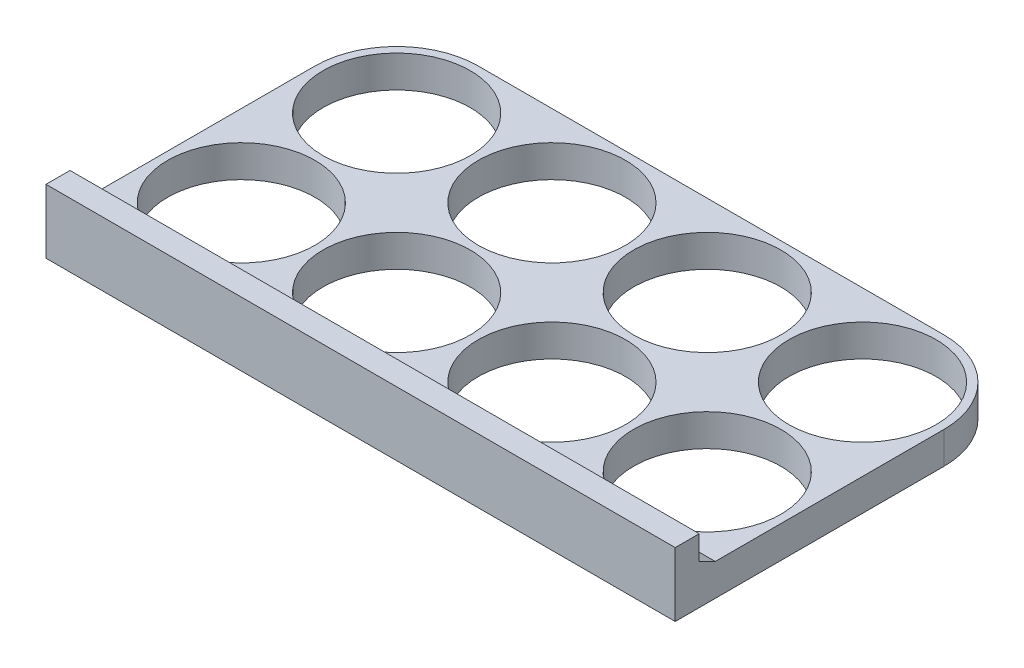
ISO-10303-21;
HEADER;
FILE_DESCRIPTION(('STEP AP214'),'2;1');
FILE_NAME('part.step','',(''),(''),'','','');
FILE_SCHEMA(('AUTOMOTIVE_DESIGN { 1 0 10303 214 1 1 1 1 }'));
ENDSEC;
DATA;
#1=APPLICATION_CONTEXT('core data for automotive mechanical design processes');
#2=APPLICATION_PROTOCOL_DEFINITION('international standard','automotive_design',2000,#1);
#3=PRODUCT_CONTEXT('',#1,'mechanical');
#4=PRODUCT('Part','Part','',(#3));
#5=PRODUCT_RELATED_PRODUCT_CATEGORY('part','',(#4));
#6=PRODUCT_DEFINITION_FORMATION('','',#4);
#7=PRODUCT_DEFINITION_CONTEXT('part definition',#1,'design');
#8=PRODUCT_DEFINITION('design','',#6,#7);
#9=PRODUCT_DEFINITION_SHAPE('','',#8);
#10=(LENGTH_UNIT() NAMED_UNIT(*) SI_UNIT(.MILLI.,.METRE.));
#11=(NAMED_UNIT(*) PLANE_ANGLE_UNIT() SI_UNIT($,.RADIAN.));
#12=(NAMED_UNIT(*) SI_UNIT($,.STERADIAN.) SOLID_ANGLE_UNIT());
#13=UNCERTAINTY_MEASURE_WITH_UNIT(LENGTH_MEASURE(1.E-05),#10,'distance_accuracy_value','');
#14=(GEOMETRIC_REPRESENTATION_CONTEXT(3) GLOBAL_UNCERTAINTY_ASSIGNED_CONTEXT((#13)) GLOBAL_UNIT_ASSIGNED_CONTEXT((#10,
#11,#12)) REPRESENTATION_CONTEXT('',''));
#15=CARTESIAN_POINT('',(0.,0.,0.));
#16=DIRECTION('',(0.,0.,1.));
#17=DIRECTION('',(1.,0.,0.));
#18=AXIS2_PLACEMENT_3D('',#15,#16,#17);
#19=CARTESIAN_POINT('',(58.2,4.,-19.4));
#20=DIRECTION('',(0.,-1.,0.));
#21=DIRECTION('',(0.,0.,-1.));
#22=AXIS2_PLACEMENT_3D('',#19,#20,#21);
#23=PLANE('',#22);
#24=CARTESIAN_POINT('',(19.3999999999999,4.,-19.4));
#25=DIRECTION('',(0.,1.,0.));
#26=DIRECTION('',(0.,0.,1.));
#27=AXIS2_PLACEMENT_3D('',#24,#25,#26);
#28=CIRCLE('',#27,9.2);
#29=CARTESIAN_POINT('',(19.3999999999999,4.,-10.2));
#30=VERTEX_POINT('',#29);
#31=EDGE_CURVE('E258',#30,#30,#28,.T.);
#32=ORIENTED_EDGE('',*,*,#31,.F.);
#33=EDGE_LOOP('',(#32));
#34=FACE_BOUND('',#33,.T.);
#35=CARTESIAN_POINT('',(38.7999999999999,4.,-19.4));
#36=DIRECTION('',(0.,1.,0.));
#37=DIRECTION('',(0.,0.,1.));
#38=AXIS2_PLACEMENT_3D('',#35,#36,#37);
#39=CIRCLE('',#38,9.2);
#40=CARTESIAN_POINT('',(38.7999999999999,4.,-10.2));
#41=VERTEX_POINT('',#40);
#42=EDGE_CURVE('E265',#41,#41,#39,.T.);
#43=ORIENTED_EDGE('',*,*,#42,.F.);
#44=EDGE_LOOP('',(#43));
#45=FACE_BOUND('',#44,.T.);
#46=CARTESIAN_POINT('',(58.1999999999999,4.,-19.4));
#47=DIRECTION('',(0.,1.,0.));
#48=DIRECTION('',(0.,0.,1.));
#49=AXIS2_PLACEMENT_3D('',#46,#47,#48);
#50=CIRCLE('',#49,9.2);
#51=CARTESIAN_POINT('',(58.1999999999999,4.,-10.2));
#52=VERTEX_POINT('',#51);
#53=EDGE_CURVE('E273',#52,#52,#50,.T.);
#54=ORIENTED_EDGE('',*,*,#53,.F.);
#55=EDGE_LOOP('',(#54));
#56=FACE_BOUND('',#55,.T.);
#57=CARTESIAN_POINT('',(0.,4.,-19.4));
#58=DIRECTION('',(0.,1.,0.));
#59=DIRECTION('',(0.,0.,1.));
#60=AXIS2_PLACEMENT_3D('',#57,#58,#59);
#61=CIRCLE('',#60,9.2);
#62=CARTESIAN_POINT('',(0.,4.,-10.2));
#63=VERTEX_POINT('',#62);
#64=EDGE_CURVE('E281',#63,#63,#61,.T.);
#65=ORIENTED_EDGE('',*,*,#64,.F.);
#66=EDGE_LOOP('',(#65));
#67=FACE_BOUND('',#66,.T.);
#68=DIRECTION('',(-1.,0.,0.));
#69=VECTOR('',#68,1.);
#70=CARTESIAN_POINT('',(68.4,4.,9.2));
#71=LINE('',#70,#69);
#72=CARTESIAN_POINT('',(68.4,4.,9.2));
#73=VERTEX_POINT('',#72);
#74=CARTESIAN_POINT('',(58.2,4.,9.2));
#75=VERTEX_POINT('',#74);
#76=EDGE_CURVE('E140',#73,#75,#71,.T.);
#77=ORIENTED_EDGE('',*,*,#76,.F.);
#78=DIRECTION('',(0.,0.,-1.));
#79=VECTOR('',#78,1.);
#80=CARTESIAN_POINT('',(68.4,4.,14.2));
#81=LINE('',#80,#79);
#82=CARTESIAN_POINT('',(68.4,4.,-19.4));
#83=VERTEX_POINT('',#82);
#84=EDGE_CURVE('E100',#73,#83,#81,.T.);
#85=ORIENTED_EDGE('',*,*,#84,.T.);
#86=CARTESIAN_POINT('',(58.2,4.,-19.4));
#87=DIRECTION('',(0.,1.,0.));
#88=DIRECTION('',(0.,0.,-1.));
#89=AXIS2_PLACEMENT_3D('',#86,#87,#88);
#90=CIRCLE('',#89,10.2);
#91=CARTESIAN_POINT('',(58.2,4.,-29.6));
#92=VERTEX_POINT('',#91);
#93=EDGE_CURVE('E160',#83,#92,#90,.T.);
#94=ORIENTED_EDGE('',*,*,#93,.T.);
#95=DIRECTION('',(-1.,0.,0.));
#96=VECTOR('',#95,1.);
#97=CARTESIAN_POINT('',(0.,4.,-29.6));
#98=LINE('',#97,#96);
#99=CARTESIAN_POINT('',(0.,4.,-29.6));
#100=VERTEX_POINT('',#99);
#101=EDGE_CURVE('E165',#92,#100,#98,.T.);
#102=ORIENTED_EDGE('',*,*,#101,.T.);
#103=CARTESIAN_POINT('',(0.,4.,-19.4));
#104=DIRECTION('',(0.,1.,0.));
#105=DIRECTION('',(0.,0.,-1.));
#106=AXIS2_PLACEMENT_3D('',#103,#104,#105);
#107=CIRCLE('',#106,10.2);
#108=CARTESIAN_POINT('',(-10.2,4.,-19.4));
#109=VERTEX_POINT('',#108);
#110=EDGE_CURVE('E63',#100,#109,#107,.T.);
#111=ORIENTED_EDGE('',*,*,#110,.T.);
#112=DIRECTION('',(0.,0.,1.));
#113=VECTOR('',#112,1.);
#114=CARTESIAN_POINT('',(-10.2,4.,0.));
#115=LINE('',#114,#113);
#116=CARTESIAN_POINT('',(-10.2,4.,9.2));
#117=VERTEX_POINT('',#116);
#118=EDGE_CURVE('E176',#109,#117,#115,.T.);
#119=ORIENTED_EDGE('',*,*,#118,.T.);
#120=CARTESIAN_POINT('',(0.,4.,9.2));
#121=VERTEX_POINT('',#120);
#122=EDGE_CURVE('E157',#121,#117,#71,.T.);
#123=ORIENTED_EDGE('',*,*,#122,.F.);
#124=CARTESIAN_POINT('',(0.,4.,0.));
#125=DIRECTION('',(0.,1.,0.));
#126=DIRECTION('',(0.,0.,1.));
#127=AXIS2_PLACEMENT_3D('',#124,#125,#126);
#128=CIRCLE('',#127,9.2);
#129=EDGE_CURVE('E183',#121,#121,#128,.T.);
#130=ORIENTED_EDGE('',*,*,#129,.F.);
#131=CARTESIAN_POINT('',(19.4,4.,9.2));
#132=VERTEX_POINT('',#131);
#133=EDGE_CURVE('E230',#132,#121,#71,.T.);
#134=ORIENTED_EDGE('',*,*,#133,.F.);
#135=CARTESIAN_POINT('',(19.4,4.,0.));
#136=DIRECTION('',(0.,1.,0.));
#137=DIRECTION('',(0.,0.,1.));
#138=AXIS2_PLACEMENT_3D('',#135,#136,#137);
#139=CIRCLE('',#138,9.2);
#140=EDGE_CURVE('E237',#132,#132,#139,.T.);
#141=ORIENTED_EDGE('',*,*,#140,.F.);
#142=CARTESIAN_POINT('',(38.8,4.,9.2));
#143=VERTEX_POINT('',#142);
#144=EDGE_CURVE('E615',#143,#132,#71,.T.);
#145=ORIENTED_EDGE('',*,*,#144,.F.);
#146=CARTESIAN_POINT('',(38.8,4.,0.));
#147=DIRECTION('',(0.,1.,0.));
#148=DIRECTION('',(0.,0.,1.));
#149=AXIS2_PLACEMENT_3D('',#146,#147,#148);
#150=CIRCLE('',#149,9.2);
#151=EDGE_CURVE('E243',#143,#143,#150,.T.);
#152=ORIENTED_EDGE('',*,*,#151,.F.);
#153=EDGE_CURVE('E155',#75,#143,#71,.T.);
#154=ORIENTED_EDGE('',*,*,#153,.F.);
#155=CARTESIAN_POINT('',(58.2,4.,0.));
#156=DIRECTION('',(0.,1.,0.));
#157=DIRECTION('',(0.,0.,1.));
#158=AXIS2_PLACEMENT_3D('',#155,#156,#157);
#159=CIRCLE('',#158,9.2);
#160=EDGE_CURVE('E152',#75,#75,#159,.T.);
#161=ORIENTED_EDGE('',*,*,#160,.F.);
#162=EDGE_LOOP('',(#77,#85,#94,#102,#111,#119,#123,#130,#134,#141,#145,#152,#154,#161));
#163=FACE_BOUND('',#162,.T.);
#164=ADVANCED_FACE('F45',(#34,#45,#56,#67,#163),#23,.F.);
#165=CARTESIAN_POINT('',(-10.2,8.,11.2));
#166=DIRECTION('',(0.,0.,1.));
#167=DIRECTION('',(1.,0.,0.));
#168=AXIS2_PLACEMENT_3D('',#165,#166,#167);
#169=PLANE('',#168);
#170=DIRECTION('',(-1.,0.,0.));
#171=VECTOR('',#170,1.);
#172=CARTESIAN_POINT('',(68.4,5.,11.2));
#173=LINE('',#172,#171);
#174=CARTESIAN_POINT('',(68.4,5.,11.2));
#175=VERTEX_POINT('',#174);
#176=CARTESIAN_POINT('',(-10.2,5.,11.2));
#177=VERTEX_POINT('',#176);
#178=EDGE_CURVE('E143',#175,#177,#173,.T.);
#179=ORIENTED_EDGE('',*,*,#178,.T.);
#180=DIRECTION('',(0.,-1.,0.));
#181=VECTOR('',#180,1.);
#182=CARTESIAN_POINT('',(-10.2,8.,11.2));
#183=LINE('',#182,#181);
#184=CARTESIAN_POINT('',(-10.2,8.,11.2));
#185=VERTEX_POINT('',#184);
#186=EDGE_CURVE('E295',#185,#177,#183,.T.);
#187=ORIENTED_EDGE('',*,*,#186,.F.);
#188=DIRECTION('',(-1.,0.,0.));
#189=VECTOR('',#188,1.);
#190=CARTESIAN_POINT('',(-10.2,8.,11.2));
#191=LINE('',#190,#189);
#192=CARTESIAN_POINT('',(68.4,8.,11.2));
#193=VERTEX_POINT('',#192);
#194=EDGE_CURVE('E298',#193,#185,#191,.T.);
#195=ORIENTED_EDGE('',*,*,#194,.F.);
#196=DIRECTION('',(0.,-1.,0.));
#197=VECTOR('',#196,1.);
#198=CARTESIAN_POINT('',(68.4,8.,11.2));
#199=LINE('',#198,#197);
#200=EDGE_CURVE('E289',#193,#175,#199,.T.);
#201=ORIENTED_EDGE('',*,*,#200,.T.);
#202=EDGE_LOOP('',(#179,#187,#195,#201));
#203=FACE_BOUND('',#202,.T.);
#204=ADVANCED_FACE('F316',(#203),#169,.F.);
#205=CARTESIAN_POINT('',(58.2,0.,-19.4));
#206=DIRECTION('',(0.,-1.,0.));
#207=DIRECTION('',(0.,0.,-1.));
#208=AXIS2_PLACEMENT_3D('',#205,#206,#207);
#209=PLANE('',#208);
#210=CARTESIAN_POINT('',(58.1999999999999,0.,-19.4));
#211=DIRECTION('',(0.,1.,0.));
#212=DIRECTION('',(0.,0.,1.));
#213=AXIS2_PLACEMENT_3D('',#210,#211,#212);
#214=CIRCLE('',#213,9.2);
#215=CARTESIAN_POINT('',(58.1999999999999,0.,-10.2));
#216=VERTEX_POINT('',#215);
#217=EDGE_CURVE('E277',#216,#216,#214,.T.);
#218=ORIENTED_EDGE('',*,*,#217,.T.);
#219=EDGE_LOOP('',(#218));
#220=FACE_BOUND('',#219,.T.);
#221=CARTESIAN_POINT('',(19.3999999999999,0.,-19.4));
#222=DIRECTION('',(0.,1.,0.));
#223=DIRECTION('',(0.,0.,1.));
#224=AXIS2_PLACEMENT_3D('',#221,#222,#223);
#225=CIRCLE('',#224,9.2);
#226=CARTESIAN_POINT('',(19.3999999999999,0.,-10.2));
#227=VERTEX_POINT('',#226);
#228=EDGE_CURVE('E261',#227,#227,#225,.T.);
#229=ORIENTED_EDGE('',*,*,#228,.T.);
#230=EDGE_LOOP('',(#229));
#231=FACE_BOUND('',#230,.T.);
#232=CARTESIAN_POINT('',(38.8,0.,0.));
#233=DIRECTION('',(0.,1.,0.));
#234=DIRECTION('',(0.,0.,1.));
#235=AXIS2_PLACEMENT_3D('',#232,#233,#234);
#236=CIRCLE('',#235,9.2);
#237=CARTESIAN_POINT('',(38.8,0.,9.2));
#238=VERTEX_POINT('',#237);
#239=EDGE_CURVE('E247',#238,#238,#236,.T.);
#240=ORIENTED_EDGE('',*,*,#239,.T.);
#241=EDGE_LOOP('',(#240));
#242=FACE_BOUND('',#241,.T.);
#243=CARTESIAN_POINT('',(0.,0.,0.));
#244=DIRECTION('',(0.,1.,0.));
#245=DIRECTION('',(0.,0.,1.));
#246=AXIS2_PLACEMENT_3D('',#243,#244,#245);
#247=CIRCLE('',#246,9.2);
#248=CARTESIAN_POINT('',(0.,0.,9.2));
#249=VERTEX_POINT('',#248);
#250=EDGE_CURVE('E169',#249,#249,#247,.T.);
#251=ORIENTED_EDGE('',*,*,#250,.T.);
#252=EDGE_LOOP('',(#251));
#253=FACE_BOUND('',#252,.T.);
#254=DIRECTION('',(0.,0.,-1.));
#255=VECTOR('',#254,1.);
#256=CARTESIAN_POINT('',(68.4,0.,0.));
#257=LINE('',#256,#255);
#258=CARTESIAN_POINT('',(68.4,0.,14.2));
#259=VERTEX_POINT('',#258);
#260=CARTESIAN_POINT('',(68.4,0.,-19.4));
#261=VERTEX_POINT('',#260);
#262=EDGE_CURVE('E93',#259,#261,#257,.T.);
#263=ORIENTED_EDGE('',*,*,#262,.F.);
#264=DIRECTION('',(1.,0.,0.));
#265=VECTOR('',#264,1.);
#266=CARTESIAN_POINT('',(-10.2,0.,14.2));
#267=LINE('',#266,#265);
#268=CARTESIAN_POINT('',(-10.2,0.,14.2));
#269=VERTEX_POINT('',#268);
#270=EDGE_CURVE('E161',#269,#259,#267,.T.);
#271=ORIENTED_EDGE('',*,*,#270,.F.);
#272=DIRECTION('',(0.,0.,1.));
#273=VECTOR('',#272,1.);
#274=CARTESIAN_POINT('',(-10.2,0.,0.));
#275=LINE('',#274,#273);
#276=CARTESIAN_POINT('',(-10.2,0.,-19.4));
#277=VERTEX_POINT('',#276);
#278=EDGE_CURVE('E86',#277,#269,#275,.T.);
#279=ORIENTED_EDGE('',*,*,#278,.F.);
#280=CARTESIAN_POINT('',(0.,0.,-19.4));
#281=DIRECTION('',(0.,1.,0.));
#282=DIRECTION('',(0.,0.,-1.));
#283=AXIS2_PLACEMENT_3D('',#280,#281,#282);
#284=CIRCLE('',#283,10.2);
#285=CARTESIAN_POINT('',(0.,0.,-29.6));
#286=VERTEX_POINT('',#285);
#287=EDGE_CURVE('E189',#286,#277,#284,.T.);
#288=ORIENTED_EDGE('',*,*,#287,.F.);
#289=DIRECTION('',(-1.,0.,0.));
#290=VECTOR('',#289,1.);
#291=CARTESIAN_POINT('',(0.,0.,-29.6));
#292=LINE('',#291,#290);
#293=CARTESIAN_POINT('',(58.2,0.,-29.6));
#294=VERTEX_POINT('',#293);
#295=EDGE_CURVE('E186',#294,#286,#292,.T.);
#296=ORIENTED_EDGE('',*,*,#295,.F.);
#297=CARTESIAN_POINT('',(58.2,0.,-19.4));
#298=DIRECTION('',(0.,1.,0.));
#299=DIRECTION('',(0.,0.,-1.));
#300=AXIS2_PLACEMENT_3D('',#297,#298,#299);
#301=CIRCLE('',#300,10.2);
#302=EDGE_CURVE('E182',#261,#294,#301,.T.);
#303=ORIENTED_EDGE('',*,*,#302,.F.);
#304=EDGE_LOOP('',(#263,#271,#279,#288,#296,#303));
#305=FACE_BOUND('',#304,.T.);
#306=CARTESIAN_POINT('',(19.4,0.,0.));
#307=DIRECTION('',(0.,1.,0.));
#308=DIRECTION('',(0.,0.,1.));
#309=AXIS2_PLACEMENT_3D('',#306,#307,#308);
#310=CIRCLE('',#309,9.2);
#311=CARTESIAN_POINT('',(19.4,0.,9.2));
#312=VERTEX_POINT('',#311);
#313=EDGE_CURVE('E239',#312,#312,#310,.T.);
#314=ORIENTED_EDGE('',*,*,#313,.T.);
#315=EDGE_LOOP('',(#314));
#316=FACE_BOUND('',#315,.T.);
#317=CARTESIAN_POINT('',(58.2,0.,0.));
#318=DIRECTION('',(0.,1.,0.));
#319=DIRECTION('',(0.,0.,1.));
#320=AXIS2_PLACEMENT_3D('',#317,#318,#319);
#321=CIRCLE('',#320,9.2);
#322=CARTESIAN_POINT('',(58.2,0.,9.2));
#323=VERTEX_POINT('',#322);
#324=EDGE_CURVE('E254',#323,#323,#321,.T.);
#325=ORIENTED_EDGE('',*,*,#324,.T.);
#326=EDGE_LOOP('',(#325));
#327=FACE_BOUND('',#326,.T.);
#328=CARTESIAN_POINT('',(38.7999999999999,0.,-19.4));
#329=DIRECTION('',(0.,1.,0.));
#330=DIRECTION('',(0.,0.,1.));
#331=AXIS2_PLACEMENT_3D('',#328,#329,#330);
#332=CIRCLE('',#331,9.2);
#333=CARTESIAN_POINT('',(38.7999999999999,0.,-10.2));
#334=VERTEX_POINT('',#333);
#335=EDGE_CURVE('E269',#334,#334,#332,.T.);
#336=ORIENTED_EDGE('',*,*,#335,.T.);
#337=EDGE_LOOP('',(#336));
#338=FACE_BOUND('',#337,.T.);
#339=CARTESIAN_POINT('',(0.,0.,-19.4));
#340=DIRECTION('',(0.,1.,0.));
#341=DIRECTION('',(0.,0.,1.));
#342=AXIS2_PLACEMENT_3D('',#339,#340,#341);
#343=CIRCLE('',#342,9.2);
#344=CARTESIAN_POINT('',(0.,0.,-10.2));
#345=VERTEX_POINT('',#344);
#346=EDGE_CURVE('E285',#345,#345,#343,.T.);
#347=ORIENTED_EDGE('',*,*,#346,.T.);
#348=EDGE_LOOP('',(#347));
#349=FACE_BOUND('',#348,.T.);
#350=ADVANCED_FACE('F217',(#220,#231,#242,#253,#305,#316,#327,#338,#349),#209,.T.);
#351=CARTESIAN_POINT('',(68.4,4.,0.));
#352=DIRECTION('',(-1.,0.,0.));
#353=DIRECTION('',(0.,0.,1.));
#354=AXIS2_PLACEMENT_3D('',#351,#352,#353);
#355=PLANE('',#354);
#356=ORIENTED_EDGE('',*,*,#84,.F.);
#357=DIRECTION('',(0.,0.447213595499958,0.894427190999916));
#358=VECTOR('',#357,1.);
#359=CARTESIAN_POINT('',(68.4,4.,9.2));
#360=LINE('',#359,#358);
#361=EDGE_CURVE('E138',#73,#175,#360,.T.);
#362=ORIENTED_EDGE('',*,*,#361,.T.);
#363=ORIENTED_EDGE('',*,*,#200,.F.);
#364=DIRECTION('',(0.,0.,-1.));
#365=VECTOR('',#364,1.);
#366=CARTESIAN_POINT('',(68.4,8.,14.2));
#367=LINE('',#366,#365);
#368=CARTESIAN_POINT('',(68.4,8.,14.2));
#369=VERTEX_POINT('',#368);
#370=EDGE_CURVE('E301',#369,#193,#367,.T.);
#371=ORIENTED_EDGE('',*,*,#370,.F.);
#372=DIRECTION('',(0.,-1.,0.));
#373=VECTOR('',#372,1.);
#374=CARTESIAN_POINT('',(68.4,4.,14.2));
#375=LINE('',#374,#373);
#376=EDGE_CURVE('E179',#369,#259,#375,.T.);
#377=ORIENTED_EDGE('',*,*,#376,.T.);
#378=ORIENTED_EDGE('',*,*,#262,.T.);
#379=DIRECTION('',(0.,-1.,0.));
#380=VECTOR('',#379,1.);
#381=CARTESIAN_POINT('',(68.4,4.,-19.4));
#382=LINE('',#381,#380);
#383=EDGE_CURVE('E11',#83,#261,#382,.T.);
#384=ORIENTED_EDGE('',*,*,#383,.F.);
#385=EDGE_LOOP('',(#356,#362,#363,#371,#377,#378,#384));
#386=FACE_BOUND('',#385,.T.);
#387=ADVANCED_FACE('F47',(#386),#355,.F.);
#388=CARTESIAN_POINT('',(58.2,4.,-19.4));
#389=DIRECTION('',(0.,-1.,0.));
#390=DIRECTION('',(0.,0.,-1.));
#391=AXIS2_PLACEMENT_3D('',#388,#389,#390);
#392=CYLINDRICAL_SURFACE('',#391,10.2);
#393=ORIENTED_EDGE('',*,*,#302,.T.);
#394=DIRECTION('',(0.,-1.,0.));
#395=VECTOR('',#394,1.);
#396=CARTESIAN_POINT('',(58.2,4.,-29.6));
#397=LINE('',#396,#395);
#398=EDGE_CURVE('E55',#92,#294,#397,.T.);
#399=ORIENTED_EDGE('',*,*,#398,.F.);
#400=ORIENTED_EDGE('',*,*,#93,.F.);
#401=ORIENTED_EDGE('',*,*,#383,.T.);
#402=EDGE_LOOP('',(#393,#399,#400,#401));
#403=FACE_BOUND('',#402,.T.);
#404=ADVANCED_FACE('F350',(#403),#392,.T.);
#405=CARTESIAN_POINT('',(0.,4.,-29.6));
#406=DIRECTION('',(0.,0.,1.));
#407=DIRECTION('',(1.,0.,0.));
#408=AXIS2_PLACEMENT_3D('',#405,#406,#407);
#409=PLANE('',#408);
#410=ORIENTED_EDGE('',*,*,#295,.T.);
#411=DIRECTION('',(0.,-1.,0.));
#412=VECTOR('',#411,1.);
#413=CARTESIAN_POINT('',(0.,4.,-29.6));
#414=LINE('',#413,#412);
#415=EDGE_CURVE('E204',#100,#286,#414,.T.);
#416=ORIENTED_EDGE('',*,*,#415,.F.);
#417=ORIENTED_EDGE('',*,*,#101,.F.);
#418=ORIENTED_EDGE('',*,*,#398,.T.);
#419=EDGE_LOOP('',(#410,#416,#417,#418));
#420=FACE_BOUND('',#419,.T.);
#421=ADVANCED_FACE('F213',(#420),#409,.F.);
#422=CARTESIAN_POINT('',(0.,4.,-19.4));
#423=DIRECTION('',(0.,-1.,0.));
#424=DIRECTION('',(0.,0.,-1.));
#425=AXIS2_PLACEMENT_3D('',#422,#423,#424);
#426=CYLINDRICAL_SURFACE('',#425,10.2);
#427=ORIENTED_EDGE('',*,*,#287,.T.);
#428=DIRECTION('',(0.,-1.,0.));
#429=VECTOR('',#428,1.);
#430=CARTESIAN_POINT('',(-10.2,4.,-19.4));
#431=LINE('',#430,#429);
#432=EDGE_CURVE('E201',#109,#277,#431,.T.);
#433=ORIENTED_EDGE('',*,*,#432,.F.);
#434=ORIENTED_EDGE('',*,*,#110,.F.);
#435=ORIENTED_EDGE('',*,*,#415,.T.);
#436=EDGE_LOOP('',(#427,#433,#434,#435));
#437=FACE_BOUND('',#436,.T.);
#438=ADVANCED_FACE('F220',(#437),#426,.T.);
#439=CARTESIAN_POINT('',(-10.2,4.,0.));
#440=DIRECTION('',(1.,0.,0.));
#441=DIRECTION('',(0.,0.,-1.));
#442=AXIS2_PLACEMENT_3D('',#439,#440,#441);
#443=PLANE('',#442);
#444=DIRECTION('',(0.,0.447213595499958,0.894427190999916));
#445=VECTOR('',#444,1.);
#446=CARTESIAN_POINT('',(-10.2,4.,9.2));
#447=LINE('',#446,#445);
#448=EDGE_CURVE('E148',#117,#177,#447,.T.);
#449=ORIENTED_EDGE('',*,*,#448,.F.);
#450=ORIENTED_EDGE('',*,*,#118,.F.);
#451=ORIENTED_EDGE('',*,*,#432,.T.);
#452=ORIENTED_EDGE('',*,*,#278,.T.);
#453=DIRECTION('',(0.,-1.,0.));
#454=VECTOR('',#453,1.);
#455=CARTESIAN_POINT('',(-10.2,4.,14.2));
#456=LINE('',#455,#454);
#457=CARTESIAN_POINT('',(-10.2,8.,14.2));
#458=VERTEX_POINT('',#457);
#459=EDGE_CURVE('E198',#458,#269,#456,.T.);
#460=ORIENTED_EDGE('',*,*,#459,.F.);
#461=DIRECTION('',(0.,0.,1.));
#462=VECTOR('',#461,1.);
#463=CARTESIAN_POINT('',(-10.2,8.,14.2));
#464=LINE('',#463,#462);
#465=EDGE_CURVE('E154',#185,#458,#464,.T.);
#466=ORIENTED_EDGE('',*,*,#465,.F.);
#467=ORIENTED_EDGE('',*,*,#186,.T.);
#468=EDGE_LOOP('',(#449,#450,#451,#452,#460,#466,#467));
#469=FACE_BOUND('',#468,.T.);
#470=ADVANCED_FACE('F223',(#469),#443,.F.);
#471=CARTESIAN_POINT('',(-10.2,4.,14.2));
#472=DIRECTION('',(0.,0.,-1.));
#473=DIRECTION('',(-1.,0.,0.));
#474=AXIS2_PLACEMENT_3D('',#471,#472,#473);
#475=PLANE('',#474);
#476=ORIENTED_EDGE('',*,*,#270,.T.);
#477=ORIENTED_EDGE('',*,*,#376,.F.);
#478=DIRECTION('',(1.,0.,0.));
#479=VECTOR('',#478,1.);
#480=CARTESIAN_POINT('',(-10.2,8.,14.2));
#481=LINE('',#480,#479);
#482=EDGE_CURVE('E304',#458,#369,#481,.T.);
#483=ORIENTED_EDGE('',*,*,#482,.F.);
#484=ORIENTED_EDGE('',*,*,#459,.T.);
#485=EDGE_LOOP('',(#476,#477,#483,#484));
#486=FACE_BOUND('',#485,.T.);
#487=ADVANCED_FACE('F324',(#486),#475,.F.);
#488=CARTESIAN_POINT('',(0.,4.,0.));
#489=DIRECTION('',(0.,-1.,0.));
#490=DIRECTION('',(0.,0.,-1.));
#491=AXIS2_PLACEMENT_3D('',#488,#489,#490);
#492=CYLINDRICAL_SURFACE('',#491,9.2);
#493=ORIENTED_EDGE('',*,*,#129,.T.);
#494=EDGE_LOOP('',(#493));
#495=FACE_BOUND('',#494,.T.);
#496=ORIENTED_EDGE('',*,*,#250,.F.);
#497=EDGE_LOOP('',(#496));
#498=FACE_BOUND('',#497,.T.);
#499=ADVANCED_FACE('F232',(#495,#498),#492,.F.);
#500=CARTESIAN_POINT('',(19.4,4.,0.));
#501=DIRECTION('',(0.,-1.,0.));
#502=DIRECTION('',(0.,0.,-1.));
#503=AXIS2_PLACEMENT_3D('',#500,#501,#502);
#504=CYLINDRICAL_SURFACE('',#503,9.2);
#505=ORIENTED_EDGE('',*,*,#140,.T.);
#506=EDGE_LOOP('',(#505));
#507=FACE_BOUND('',#506,.T.);
#508=ORIENTED_EDGE('',*,*,#313,.F.);
#509=EDGE_LOOP('',(#508));
#510=FACE_BOUND('',#509,.T.);
#511=ADVANCED_FACE('F331',(#507,#510),#504,.F.);
#512=CARTESIAN_POINT('',(38.8,4.,0.));
#513=DIRECTION('',(0.,-1.,0.));
#514=DIRECTION('',(0.,0.,-1.));
#515=AXIS2_PLACEMENT_3D('',#512,#513,#514);
#516=CYLINDRICAL_SURFACE('',#515,9.2);
#517=ORIENTED_EDGE('',*,*,#151,.T.);
#518=EDGE_LOOP('',(#517));
#519=FACE_BOUND('',#518,.T.);
#520=ORIENTED_EDGE('',*,*,#239,.F.);
#521=EDGE_LOOP('',(#520));
#522=FACE_BOUND('',#521,.T.);
#523=ADVANCED_FACE('F359',(#519,#522),#516,.F.);
#524=CARTESIAN_POINT('',(58.2,4.,0.));
#525=DIRECTION('',(0.,-1.,0.));
#526=DIRECTION('',(0.,0.,-1.));
#527=AXIS2_PLACEMENT_3D('',#524,#525,#526);
#528=CYLINDRICAL_SURFACE('',#527,9.2);
#529=ORIENTED_EDGE('',*,*,#160,.T.);
#530=EDGE_LOOP('',(#529));
#531=FACE_BOUND('',#530,.T.);
#532=ORIENTED_EDGE('',*,*,#324,.F.);
#533=EDGE_LOOP('',(#532));
#534=FACE_BOUND('',#533,.T.);
#535=ADVANCED_FACE('F361',(#531,#534),#528,.F.);
#536=CARTESIAN_POINT('',(19.3999999999999,4.,-19.4));
#537=DIRECTION('',(0.,-1.,0.));
#538=DIRECTION('',(0.,0.,-1.));
#539=AXIS2_PLACEMENT_3D('',#536,#537,#538);
#540=CYLINDRICAL_SURFACE('',#539,9.2);
#541=ORIENTED_EDGE('',*,*,#31,.T.);
#542=EDGE_LOOP('',(#541));
#543=FACE_BOUND('',#542,.T.);
#544=ORIENTED_EDGE('',*,*,#228,.F.);
#545=EDGE_LOOP('',(#544));
#546=FACE_BOUND('',#545,.T.);
#547=ADVANCED_FACE('F368',(#543,#546),#540,.F.);
#548=CARTESIAN_POINT('',(38.7999999999999,4.,-19.4));
#549=DIRECTION('',(0.,-1.,0.));
#550=DIRECTION('',(0.,0.,-1.));
#551=AXIS2_PLACEMENT_3D('',#548,#549,#550);
#552=CYLINDRICAL_SURFACE('',#551,9.2);
#553=ORIENTED_EDGE('',*,*,#42,.T.);
#554=EDGE_LOOP('',(#553));
#555=FACE_BOUND('',#554,.T.);
#556=ORIENTED_EDGE('',*,*,#335,.F.);
#557=EDGE_LOOP('',(#556));
#558=FACE_BOUND('',#557,.T.);
#559=ADVANCED_FACE('F375',(#555,#558),#552,.F.);
#560=CARTESIAN_POINT('',(58.1999999999999,4.,-19.4));
#561=DIRECTION('',(0.,-1.,0.));
#562=DIRECTION('',(0.,0.,-1.));
#563=AXIS2_PLACEMENT_3D('',#560,#561,#562);
#564=CYLINDRICAL_SURFACE('',#563,9.2);
#565=ORIENTED_EDGE('',*,*,#53,.T.);
#566=EDGE_LOOP('',(#565));
#567=FACE_BOUND('',#566,.T.);
#568=ORIENTED_EDGE('',*,*,#217,.F.);
#569=EDGE_LOOP('',(#568));
#570=FACE_BOUND('',#569,.T.);
#571=ADVANCED_FACE('F379',(#567,#570),#564,.F.);
#572=CARTESIAN_POINT('',(0.,4.,-19.4));
#573=DIRECTION('',(0.,-1.,0.));
#574=DIRECTION('',(0.,0.,-1.));
#575=AXIS2_PLACEMENT_3D('',#572,#573,#574);
#576=CYLINDRICAL_SURFACE('',#575,9.2);
#577=ORIENTED_EDGE('',*,*,#64,.T.);
#578=EDGE_LOOP('',(#577));
#579=FACE_BOUND('',#578,.T.);
#580=ORIENTED_EDGE('',*,*,#346,.F.);
#581=EDGE_LOOP('',(#580));
#582=FACE_BOUND('',#581,.T.);
#583=ADVANCED_FACE('F383',(#579,#582),#576,.F.);
#584=CARTESIAN_POINT('',(0.,8.,0.));
#585=DIRECTION('',(0.,-1.,0.));
#586=DIRECTION('',(0.,0.,-1.));
#587=AXIS2_PLACEMENT_3D('',#584,#585,#586);
#588=PLANE('',#587);
#589=ORIENTED_EDGE('',*,*,#465,.T.);
#590=ORIENTED_EDGE('',*,*,#482,.T.);
#591=ORIENTED_EDGE('',*,*,#370,.T.);
#592=ORIENTED_EDGE('',*,*,#194,.T.);
#593=EDGE_LOOP('',(#589,#590,#591,#592));
#594=FACE_BOUND('',#593,.T.);
#595=ADVANCED_FACE('F321',(#594),#588,.F.);
#596=CARTESIAN_POINT('',(68.4,4.,9.2));
#597=DIRECTION('',(0.,-0.894427190999916,0.447213595499958));
#598=DIRECTION('',(0.,-0.447213595499958,-0.894427190999916));
#599=AXIS2_PLACEMENT_3D('',#596,#597,#598);
#600=PLANE('',#599);
#601=ORIENTED_EDGE('',*,*,#448,.T.);
#602=ORIENTED_EDGE('',*,*,#178,.F.);
#603=ORIENTED_EDGE('',*,*,#361,.F.);
#604=ORIENTED_EDGE('',*,*,#76,.T.);
#605=ORIENTED_EDGE('',*,*,#153,.T.);
#606=ORIENTED_EDGE('',*,*,#144,.T.);
#607=ORIENTED_EDGE('',*,*,#133,.T.);
#608=ORIENTED_EDGE('',*,*,#122,.T.);
#609=EDGE_LOOP('',(#601,#602,#603,#604,#605,#606,#607,#608));
#610=FACE_BOUND('',#609,.T.);
#611=ADVANCED_FACE('F139',(#610),#600,.F.);
#612=CLOSED_SHELL('',(#164,#204,#350,#387,#404,#421,#438,#470,#487,#499,#511,#523,#535,#547,
#559,#571,#583,#595,#611));
#613=MANIFOLD_SOLID_BREP('B2',#612);
#614=ADVANCED_BREP_SHAPE_REPRESENTATION('',(#18,#613),#14);
#615=SHAPE_DEFINITION_REPRESENTATION(#9,#614);
ENDSEC;
END-ISO-10303-21;
